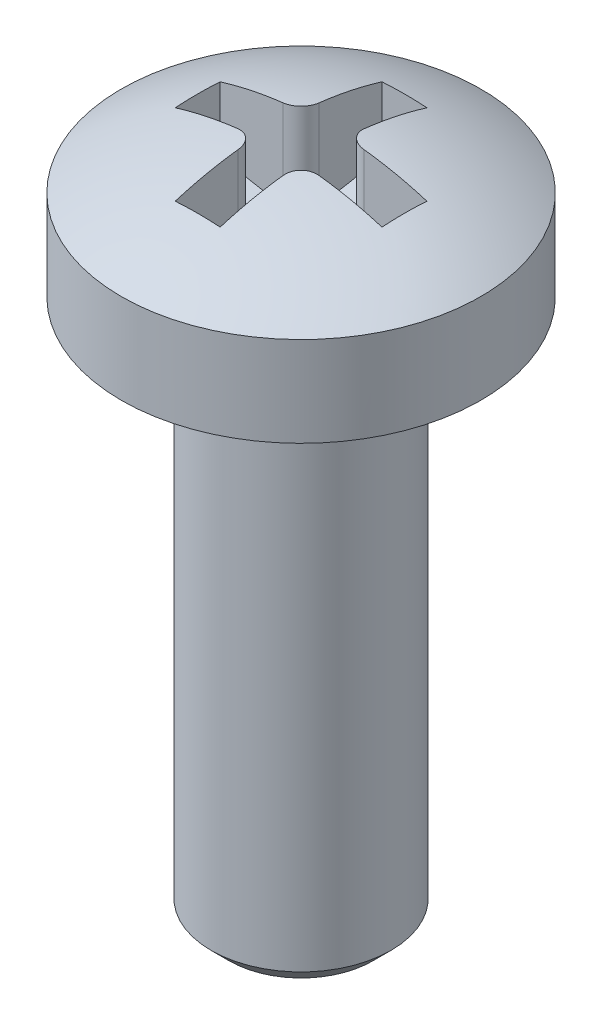
ISO-10303-21;
HEADER;
FILE_DESCRIPTION(('STEP AP214'),'2;1');
FILE_NAME('part.step','',(''),(''),'','','');
FILE_SCHEMA(('AUTOMOTIVE_DESIGN { 1 0 10303 214 1 1 1 1 }'));
ENDSEC;
DATA;
#1=APPLICATION_CONTEXT('core data for automotive mechanical design processes');
#2=APPLICATION_PROTOCOL_DEFINITION('international standard','automotive_design',2000,#1);
#3=PRODUCT_CONTEXT('',#1,'mechanical');
#4=PRODUCT('Part','Part','',(#3));
#5=PRODUCT_RELATED_PRODUCT_CATEGORY('part','',(#4));
#6=PRODUCT_DEFINITION_FORMATION('','',#4);
#7=PRODUCT_DEFINITION_CONTEXT('part definition',#1,'design');
#8=PRODUCT_DEFINITION('design','',#6,#7);
#9=PRODUCT_DEFINITION_SHAPE('','',#8);
#10=(LENGTH_UNIT() NAMED_UNIT(*) SI_UNIT(.MILLI.,.METRE.));
#11=(NAMED_UNIT(*) PLANE_ANGLE_UNIT() SI_UNIT($,.RADIAN.));
#12=(NAMED_UNIT(*) SI_UNIT($,.STERADIAN.) SOLID_ANGLE_UNIT());
#13=UNCERTAINTY_MEASURE_WITH_UNIT(LENGTH_MEASURE(1.E-05),#10,'distance_accuracy_value','');
#14=(GEOMETRIC_REPRESENTATION_CONTEXT(3) GLOBAL_UNCERTAINTY_ASSIGNED_CONTEXT((#13)) GLOBAL_UNIT_ASSIGNED_CONTEXT((#10,
#11,#12)) REPRESENTATION_CONTEXT('',''));
#15=CARTESIAN_POINT('',(0.,0.,0.));
#16=DIRECTION('',(0.,0.,1.));
#17=DIRECTION('',(1.,0.,0.));
#18=AXIS2_PLACEMENT_3D('',#15,#16,#17);
#19=CARTESIAN_POINT('',(2.,-12.,0.));
#20=DIRECTION('',(0.,1.,0.));
#21=DIRECTION('',(0.,0.,1.));
#22=AXIS2_PLACEMENT_3D('',#19,#20,#21);
#23=PLANE('',#22);
#24=CARTESIAN_POINT('',(0.,-12.,0.));
#25=DIRECTION('',(0.,1.,0.));
#26=DIRECTION('',(0.,0.,1.));
#27=AXIS2_PLACEMENT_3D('',#24,#25,#26);
#28=CIRCLE('',#27,1.6);
#29=CARTESIAN_POINT('',(0.,-12.,1.6));
#30=VERTEX_POINT('',#29);
#31=EDGE_CURVE('E11',#30,#30,#28,.F.);
#32=ORIENTED_EDGE('',*,*,#31,.T.);
#33=EDGE_LOOP('',(#32));
#34=FACE_BOUND('',#33,.T.);
#35=ADVANCED_FACE('F37',(#34),#23,.F.);
#36=CARTESIAN_POINT('',(0.,-4.72272727272728,0.));
#37=DIRECTION('',(0.,1.,0.));
#38=DIRECTION('',(1.,0.,0.));
#39=AXIS2_PLACEMENT_3D('',#36,#37,#38);
#40=SPHERICAL_SURFACE('',#39,7.82272727272728);
#41=CARTESIAN_POINT('',(0.5,-4.72272727272728,0.));
#42=DIRECTION('',(1.,0.,0.));
#43=DIRECTION('',(0.,0.,-1.));
#44=AXIS2_PLACEMENT_3D('',#41,#42,#43);
#45=CIRCLE('',#44,7.80673183755348);
#46=CARTESIAN_POINT('',(0.5,2.73750476008987,-2.3));
#47=VERTEX_POINT('',#46);
#48=CARTESIAN_POINT('',(0.5,3.03195273249996,-0.9));
#49=VERTEX_POINT('',#48);
#50=EDGE_CURVE('E195',#47,#49,#45,.T.);
#51=ORIENTED_EDGE('',*,*,#50,.T.);
#52=CARTESIAN_POINT('',(0.5,3.03195273249996,-0.9));
#53=CARTESIAN_POINT('',(0.499980445653111,3.03454133641409,-0.877715199489853));
#54=CARTESIAN_POINT('',(0.501861325410847,3.0369109081898,-0.855406290685576));
#55=CARTESIAN_POINT('',(0.509308944557218,3.04115309750786,-0.811373363194762));
#56=CARTESIAN_POINT('',(0.514874142284133,3.04302592244948,-0.789649103823202));
#57=CARTESIAN_POINT('',(0.529581237998282,3.04621922226135,-0.747382590966706));
#58=CARTESIAN_POINT('',(0.538725894104163,3.0475392695665,-0.726841263013532));
#59=CARTESIAN_POINT('',(0.560335395409864,3.04958563422558,-0.687561895208892));
#60=CARTESIAN_POINT('',(0.572799188800053,3.05031213937239,-0.668823286645484));
#61=CARTESIAN_POINT('',(0.600596407799792,3.05114682561896,-0.633816736919395));
#62=CARTESIAN_POINT('',(0.615908512897499,3.05125942358876,-0.617531968951503));
#63=CARTESIAN_POINT('',(0.649026593510928,3.0508747494218,-0.587736528915892));
#64=CARTESIAN_POINT('',(0.666832948845617,3.05037738431157,-0.57422628012003));
#65=CARTESIAN_POINT('',(0.704363578386314,3.04879030089852,-0.550401537052683));
#66=CARTESIAN_POINT('',(0.724081674108829,3.04770244181268,-0.540077170971166));
#67=CARTESIAN_POINT('',(0.764919862434989,3.04496752601447,-0.522847557382613));
#68=CARTESIAN_POINT('',(0.786039420133905,3.04332068167708,-0.515941013789886));
#69=CARTESIAN_POINT('',(0.822714805755103,3.04007942212771,-0.5072274099574));
#70=CARTESIAN_POINT('',(0.838074093965798,3.03861284502167,-0.504517057384848));
#71=CARTESIAN_POINT('',(0.868957976534767,3.0354499847468,-0.500903202638105));
#72=CARTESIAN_POINT('',(0.88448230264661,3.03375403356009,-0.499997118337815));
#73=CARTESIAN_POINT('',(0.9,3.03195273249996,-0.5));
#74=B_SPLINE_CURVE_WITH_KNOTS('',3,(#52,#53,#54,#55,#56,#57,#58,#59,#60,#61,#62,#63,#64,#65,#66,
#67,#68,#69,#70,#71,#72,#73),.UNSPECIFIED.,.F.,.F.,(4,2,2,2,2,2,2,2,2,2,4),(0.,
0.0672224170043276,0.134416723302517,0.201662907801201,0.26888780779591,0.335628401088124,
0.402379168562592,0.468920974876219,0.535437528240593,0.582332561709017,0.629160434341086),.UNSPECIFIED.);
#75=CARTESIAN_POINT('',(0.9,3.03195273249996,-0.5));
#76=VERTEX_POINT('',#75);
#77=EDGE_CURVE('E257',#49,#76,#74,.T.);
#78=ORIENTED_EDGE('',*,*,#77,.T.);
#79=CARTESIAN_POINT('',(0.,-4.72272727272728,-0.5));
#80=DIRECTION('',(0.,0.,-1.));
#81=DIRECTION('',(-1.,0.,0.));
#82=AXIS2_PLACEMENT_3D('',#79,#80,#81);
#83=CIRCLE('',#82,7.80673183755348);
#84=CARTESIAN_POINT('',(2.3,2.73750476008987,-0.5));
#85=VERTEX_POINT('',#84);
#86=EDGE_CURVE('E193',#76,#85,#83,.T.);
#87=ORIENTED_EDGE('',*,*,#86,.T.);
#88=CARTESIAN_POINT('',(2.3,-4.72272727272728,0.));
#89=DIRECTION('',(1.,0.,0.));
#90=DIRECTION('',(0.,0.,-1.));
#91=AXIS2_PLACEMENT_3D('',#88,#89,#90);
#92=CIRCLE('',#91,7.47696876972688);
#93=CARTESIAN_POINT('',(2.3,2.73750476008987,0.5));
#94=VERTEX_POINT('',#93);
#95=EDGE_CURVE('E170',#85,#94,#92,.T.);
#96=ORIENTED_EDGE('',*,*,#95,.T.);
#97=CARTESIAN_POINT('',(0.,-4.72272727272728,0.5));
#98=DIRECTION('',(0.,0.,1.));
#99=DIRECTION('',(1.,0.,0.));
#100=AXIS2_PLACEMENT_3D('',#97,#98,#99);
#101=CIRCLE('',#100,7.80673183755348);
#102=CARTESIAN_POINT('',(0.9,3.03195273249996,0.5));
#103=VERTEX_POINT('',#102);
#104=EDGE_CURVE('E219',#94,#103,#101,.T.);
#105=ORIENTED_EDGE('',*,*,#104,.T.);
#106=CARTESIAN_POINT('',(0.9,3.03195273249996,0.5));
#107=CARTESIAN_POINT('',(0.877715199489853,3.03454133641409,0.499980445653111));
#108=CARTESIAN_POINT('',(0.855406290685576,3.0369109081898,0.501861325410847));
#109=CARTESIAN_POINT('',(0.811373363194762,3.04115309750786,0.509308944557218));
#110=CARTESIAN_POINT('',(0.789649103823202,3.04302592244948,0.514874142284133));
#111=CARTESIAN_POINT('',(0.747382590966706,3.04621922226135,0.529581237998282));
#112=CARTESIAN_POINT('',(0.726841263013532,3.0475392695665,0.538725894104163));
#113=CARTESIAN_POINT('',(0.687561895208891,3.04958563422558,0.560335395409864));
#114=CARTESIAN_POINT('',(0.668823286645484,3.05031213937239,0.572799188800053));
#115=CARTESIAN_POINT('',(0.633816736919395,3.05114682561896,0.600596407799792));
#116=CARTESIAN_POINT('',(0.617531968951503,3.05125942358877,0.6159085128975));
#117=CARTESIAN_POINT('',(0.587736528915892,3.0508747494218,0.649026593510929));
#118=CARTESIAN_POINT('',(0.57422628012003,3.05037738431157,0.666832948845617));
#119=CARTESIAN_POINT('',(0.550401537052683,3.04879030089852,0.704363578386314));
#120=CARTESIAN_POINT('',(0.540077170971166,3.04770244181268,0.724081674108829));
#121=CARTESIAN_POINT('',(0.522847557382613,3.04496752601447,0.764919862434989));
#122=CARTESIAN_POINT('',(0.515941013789886,3.04332068167708,0.786039420133905));
#123=CARTESIAN_POINT('',(0.5072274099574,3.04007942212771,0.822714805755103));
#124=CARTESIAN_POINT('',(0.504517057384848,3.03861284502167,0.838074093965798));
#125=CARTESIAN_POINT('',(0.500903202638105,3.03544998474679,0.868957976534767));
#126=CARTESIAN_POINT('',(0.499997118337815,3.03375403356009,0.884482302646609));
#127=CARTESIAN_POINT('',(0.5,3.03195273249996,0.9));
#128=B_SPLINE_CURVE_WITH_KNOTS('',3,(#106,#107,#108,#109,#110,#111,#112,#113,#114,#115,#116,
#117,#118,#119,#120,#121,#122,#123,#124,#125,#126,#127),.UNSPECIFIED.,.F.,.F.,(4,2,2,2,2,2,2,2,
2,2,4),(0.,0.0672224170043276,0.134416723302517,0.201662907801201,0.268887807795911,
0.335628401088124,0.402379168562592,0.468920974876219,0.535437528240593,0.582332561709017,
0.629160434341086),.UNSPECIFIED.);
#129=CARTESIAN_POINT('',(0.5,3.03195273249996,0.9));
#130=VERTEX_POINT('',#129);
#131=EDGE_CURVE('E252',#103,#130,#128,.T.);
#132=ORIENTED_EDGE('',*,*,#131,.T.);
#133=CARTESIAN_POINT('',(0.5,-4.72272727272728,0.));
#134=DIRECTION('',(1.,0.,0.));
#135=DIRECTION('',(0.,0.,-1.));
#136=AXIS2_PLACEMENT_3D('',#133,#134,#135);
#137=CIRCLE('',#136,7.80673183755348);
#138=CARTESIAN_POINT('',(0.5,2.73750476008987,2.3));
#139=VERTEX_POINT('',#138);
#140=EDGE_CURVE('E217',#130,#139,#137,.T.);
#141=ORIENTED_EDGE('',*,*,#140,.T.);
#142=CARTESIAN_POINT('',(0.,-4.72272727272728,2.3));
#143=DIRECTION('',(0.,0.,1.));
#144=DIRECTION('',(1.,0.,0.));
#145=AXIS2_PLACEMENT_3D('',#142,#143,#144);
#146=CIRCLE('',#145,7.47696876972688);
#147=CARTESIAN_POINT('',(-0.5,2.73750476008987,2.3));
#148=VERTEX_POINT('',#147);
#149=EDGE_CURVE('E214',#139,#148,#146,.T.);
#150=ORIENTED_EDGE('',*,*,#149,.T.);
#151=CARTESIAN_POINT('',(-0.5,-4.72272727272728,0.));
#152=DIRECTION('',(-1.,0.,0.));
#153=DIRECTION('',(0.,0.,1.));
#154=AXIS2_PLACEMENT_3D('',#151,#152,#153);
#155=CIRCLE('',#154,7.80673183755348);
#156=CARTESIAN_POINT('',(-0.5,3.03195273249996,0.9));
#157=VERTEX_POINT('',#156);
#158=EDGE_CURVE('E211',#148,#157,#155,.T.);
#159=ORIENTED_EDGE('',*,*,#158,.T.);
#160=CARTESIAN_POINT('',(-0.5,3.03195273249996,0.9));
#161=CARTESIAN_POINT('',(-0.499980445653111,3.03454133641409,0.877715199489853));
#162=CARTESIAN_POINT('',(-0.501861325410847,3.0369109081898,0.855406290685576));
#163=CARTESIAN_POINT('',(-0.509308944557218,3.04115309750786,0.811373363194762));
#164=CARTESIAN_POINT('',(-0.514874142284133,3.04302592244948,0.789649103823202));
#165=CARTESIAN_POINT('',(-0.529581237998282,3.04621922226135,0.747382590966706));
#166=CARTESIAN_POINT('',(-0.538725894104163,3.0475392695665,0.726841263013532));
#167=CARTESIAN_POINT('',(-0.560335395409864,3.04958563422558,0.687561895208892));
#168=CARTESIAN_POINT('',(-0.572799188800053,3.05031213937239,0.668823286645484));
#169=CARTESIAN_POINT('',(-0.600596407799792,3.05114682561896,0.633816736919395));
#170=CARTESIAN_POINT('',(-0.6159085128975,3.05125942358876,0.617531968951503));
#171=CARTESIAN_POINT('',(-0.649026593510929,3.0508747494218,0.587736528915892));
#172=CARTESIAN_POINT('',(-0.666832948845617,3.05037738431157,0.57422628012003));
#173=CARTESIAN_POINT('',(-0.704363578386314,3.04879030089852,0.550401537052683));
#174=CARTESIAN_POINT('',(-0.724081674108829,3.04770244181268,0.540077170971166));
#175=CARTESIAN_POINT('',(-0.764919862434989,3.04496752601447,0.522847557382613));
#176=CARTESIAN_POINT('',(-0.786039420133905,3.04332068167708,0.515941013789887));
#177=CARTESIAN_POINT('',(-0.822714805755103,3.04007942212771,0.5072274099574));
#178=CARTESIAN_POINT('',(-0.838074093965798,3.03861284502167,0.504517057384848));
#179=CARTESIAN_POINT('',(-0.868957976534767,3.0354499847468,0.500903202638105));
#180=CARTESIAN_POINT('',(-0.88448230264661,3.03375403356009,0.499997118337815));
#181=CARTESIAN_POINT('',(-0.9,3.03195273249996,0.5));
#182=B_SPLINE_CURVE_WITH_KNOTS('',3,(#160,#161,#162,#163,#164,#165,#166,#167,#168,#169,#170,
#171,#172,#173,#174,#175,#176,#177,#178,#179,#180,#181),.UNSPECIFIED.,.F.,.F.,(4,2,2,2,2,2,2,2,
2,2,4),(0.,0.0672224170043276,0.134416723302517,0.201662907801201,0.26888780779591,
0.335628401088124,0.402379168562592,0.468920974876219,0.535437528240592,0.582332561709017,
0.629160434341086),.UNSPECIFIED.);
#183=CARTESIAN_POINT('',(-0.9,3.03195273249996,0.5));
#184=VERTEX_POINT('',#183);
#185=EDGE_CURVE('E231',#157,#184,#182,.T.);
#186=ORIENTED_EDGE('',*,*,#185,.T.);
#187=CARTESIAN_POINT('',(0.,-4.72272727272728,0.5));
#188=DIRECTION('',(0.,0.,1.));
#189=DIRECTION('',(1.,0.,0.));
#190=AXIS2_PLACEMENT_3D('',#187,#188,#189);
#191=CIRCLE('',#190,7.80673183755348);
#192=CARTESIAN_POINT('',(-2.3,2.73750476008987,0.5));
#193=VERTEX_POINT('',#192);
#194=EDGE_CURVE('E209',#184,#193,#191,.T.);
#195=ORIENTED_EDGE('',*,*,#194,.T.);
#196=CARTESIAN_POINT('',(-2.3,-4.72272727272728,0.));
#197=DIRECTION('',(-1.,0.,0.));
#198=DIRECTION('',(0.,0.,1.));
#199=AXIS2_PLACEMENT_3D('',#196,#197,#198);
#200=CIRCLE('',#199,7.47696876972688);
#201=CARTESIAN_POINT('',(-2.3,2.73750476008987,-0.5));
#202=VERTEX_POINT('',#201);
#203=EDGE_CURVE('E206',#193,#202,#200,.T.);
#204=ORIENTED_EDGE('',*,*,#203,.T.);
#205=CARTESIAN_POINT('',(0.,-4.72272727272728,-0.5));
#206=DIRECTION('',(0.,0.,-1.));
#207=DIRECTION('',(-1.,0.,0.));
#208=AXIS2_PLACEMENT_3D('',#205,#206,#207);
#209=CIRCLE('',#208,7.80673183755348);
#210=CARTESIAN_POINT('',(-0.9,3.03195273249996,-0.5));
#211=VERTEX_POINT('',#210);
#212=EDGE_CURVE('E203',#202,#211,#209,.T.);
#213=ORIENTED_EDGE('',*,*,#212,.T.);
#214=CARTESIAN_POINT('',(-0.9,3.03195273249996,-0.5));
#215=CARTESIAN_POINT('',(-0.877715199489853,3.03454133641409,-0.499980445653111));
#216=CARTESIAN_POINT('',(-0.855406290685576,3.0369109081898,-0.501861325410847));
#217=CARTESIAN_POINT('',(-0.811373363194762,3.04115309750786,-0.509308944557218));
#218=CARTESIAN_POINT('',(-0.789649103823202,3.04302592244948,-0.514874142284133));
#219=CARTESIAN_POINT('',(-0.747382590966706,3.04621922226135,-0.529581237998282));
#220=CARTESIAN_POINT('',(-0.726841263013532,3.0475392695665,-0.538725894104163));
#221=CARTESIAN_POINT('',(-0.687561895208892,3.04958563422558,-0.560335395409864));
#222=CARTESIAN_POINT('',(-0.668823286645484,3.05031213937239,-0.572799188800053));
#223=CARTESIAN_POINT('',(-0.633816736919395,3.05114682561896,-0.600596407799792));
#224=CARTESIAN_POINT('',(-0.617531968951503,3.05125942358877,-0.6159085128975));
#225=CARTESIAN_POINT('',(-0.587736528915892,3.0508747494218,-0.649026593510929));
#226=CARTESIAN_POINT('',(-0.57422628012003,3.05037738431157,-0.666832948845617));
#227=CARTESIAN_POINT('',(-0.550401537052683,3.04879030089852,-0.704363578386314));
#228=CARTESIAN_POINT('',(-0.540077170971166,3.04770244181268,-0.724081674108829));
#229=CARTESIAN_POINT('',(-0.522847557382613,3.04496752601447,-0.764919862434989));
#230=CARTESIAN_POINT('',(-0.515941013789887,3.04332068167708,-0.786039420133905));
#231=CARTESIAN_POINT('',(-0.5072274099574,3.04007942212771,-0.822714805755103));
#232=CARTESIAN_POINT('',(-0.504517057384848,3.03861284502167,-0.838074093965798));
#233=CARTESIAN_POINT('',(-0.500903202638105,3.03544998474679,-0.868957976534767));
#234=CARTESIAN_POINT('',(-0.499997118337815,3.03375403356009,-0.88448230264661));
#235=CARTESIAN_POINT('',(-0.5,3.03195273249996,-0.9));
#236=B_SPLINE_CURVE_WITH_KNOTS('',3,(#214,#215,#216,#217,#218,#219,#220,#221,#222,#223,#224,
#225,#226,#227,#228,#229,#230,#231,#232,#233,#234,#235),.UNSPECIFIED.,.F.,.F.,(4,2,2,2,2,2,2,2,
2,2,4),(0.,0.0672224170043276,0.134416723302517,0.201662907801201,0.268887807795911,
0.335628401088124,0.402379168562592,0.468920974876219,0.535437528240593,0.582332561709018,
0.629160434341086),.UNSPECIFIED.);
#237=CARTESIAN_POINT('',(-0.5,3.03195273249996,-0.9));
#238=VERTEX_POINT('',#237);
#239=EDGE_CURVE('E225',#211,#238,#236,.T.);
#240=ORIENTED_EDGE('',*,*,#239,.T.);
#241=CARTESIAN_POINT('',(-0.5,-4.72272727272728,0.));
#242=DIRECTION('',(-1.,0.,0.));
#243=DIRECTION('',(0.,0.,1.));
#244=AXIS2_PLACEMENT_3D('',#241,#242,#243);
#245=CIRCLE('',#244,7.80673183755348);
#246=CARTESIAN_POINT('',(-0.5,2.73750476008987,-2.3));
#247=VERTEX_POINT('',#246);
#248=EDGE_CURVE('E201',#238,#247,#245,.T.);
#249=ORIENTED_EDGE('',*,*,#248,.T.);
#250=CARTESIAN_POINT('',(0.,-4.72272727272728,-2.3));
#251=DIRECTION('',(0.,0.,-1.));
#252=DIRECTION('',(-1.,0.,0.));
#253=AXIS2_PLACEMENT_3D('',#250,#251,#252);
#254=CIRCLE('',#253,7.47696876972688);
#255=EDGE_CURVE('E198',#247,#47,#254,.T.);
#256=ORIENTED_EDGE('',*,*,#255,.T.);
#257=EDGE_LOOP('',(#51,#78,#87,#96,#105,#132,#141,#150,#159,#186,#195,#204,#213,#240,#249,#256));
#258=FACE_BOUND('',#257,.T.);
#259=CARTESIAN_POINT('',(0.,2.,0.));
#260=DIRECTION('',(0.,1.,0.));
#261=DIRECTION('',(0.,0.,1.));
#262=AXIS2_PLACEMENT_3D('',#259,#260,#261);
#263=CIRCLE('',#262,4.);
#264=CARTESIAN_POINT('',(0.,2.,4.));
#265=VERTEX_POINT('',#264);
#266=EDGE_CURVE('E189',#265,#265,#263,.T.);
#267=ORIENTED_EDGE('',*,*,#266,.T.);
#268=EDGE_LOOP('',(#267));
#269=FACE_BOUND('',#268,.T.);
#270=ADVANCED_FACE('F239',(#258,#269),#40,.T.);
#271=CARTESIAN_POINT('',(0.,3.1,0.));
#272=DIRECTION('',(0.,1.,0.));
#273=DIRECTION('',(0.,0.,1.));
#274=AXIS2_PLACEMENT_3D('',#271,#272,#273);
#275=CYLINDRICAL_SURFACE('',#274,4.);
#276=ORIENTED_EDGE('',*,*,#266,.F.);
#277=EDGE_LOOP('',(#276));
#278=FACE_BOUND('',#277,.T.);
#279=CARTESIAN_POINT('',(0.,0.,0.));
#280=DIRECTION('',(0.,1.,0.));
#281=DIRECTION('',(0.,0.,1.));
#282=AXIS2_PLACEMENT_3D('',#279,#280,#281);
#283=CIRCLE('',#282,4.);
#284=CARTESIAN_POINT('',(0.,0.,4.));
#285=VERTEX_POINT('',#284);
#286=EDGE_CURVE('E181',#285,#285,#283,.T.);
#287=ORIENTED_EDGE('',*,*,#286,.T.);
#288=EDGE_LOOP('',(#287));
#289=FACE_BOUND('',#288,.T.);
#290=ADVANCED_FACE('F244',(#278,#289),#275,.T.);
#291=CARTESIAN_POINT('',(4.,0.,0.));
#292=DIRECTION('',(0.,1.,0.));
#293=DIRECTION('',(0.,0.,1.));
#294=AXIS2_PLACEMENT_3D('',#291,#292,#293);
#295=PLANE('',#294);
#296=ORIENTED_EDGE('',*,*,#286,.F.);
#297=EDGE_LOOP('',(#296));
#298=FACE_BOUND('',#297,.T.);
#299=CARTESIAN_POINT('',(0.,0.,0.));
#300=DIRECTION('',(0.,1.,0.));
#301=DIRECTION('',(0.,0.,1.));
#302=AXIS2_PLACEMENT_3D('',#299,#300,#301);
#303=CIRCLE('',#302,2.);
#304=CARTESIAN_POINT('',(0.,0.,2.));
#305=VERTEX_POINT('',#304);
#306=EDGE_CURVE('E178',#305,#305,#303,.T.);
#307=ORIENTED_EDGE('',*,*,#306,.T.);
#308=EDGE_LOOP('',(#307));
#309=FACE_BOUND('',#308,.T.);
#310=ADVANCED_FACE('F331',(#298,#309),#295,.F.);
#311=CARTESIAN_POINT('',(0.,3.1,0.));
#312=DIRECTION('',(0.,1.,0.));
#313=DIRECTION('',(0.,0.,1.));
#314=AXIS2_PLACEMENT_3D('',#311,#312,#313);
#315=CYLINDRICAL_SURFACE('',#314,2.);
#316=CARTESIAN_POINT('',(0.,-11.6,0.));
#317=DIRECTION('',(0.,1.,0.));
#318=DIRECTION('',(0.,0.,1.));
#319=AXIS2_PLACEMENT_3D('',#316,#317,#318);
#320=CIRCLE('',#319,2.);
#321=CARTESIAN_POINT('',(0.,-11.6,2.));
#322=VERTEX_POINT('',#321);
#323=EDGE_CURVE('E45',#322,#322,#320,.T.);
#324=ORIENTED_EDGE('',*,*,#323,.T.);
#325=EDGE_LOOP('',(#324));
#326=FACE_BOUND('',#325,.T.);
#327=ORIENTED_EDGE('',*,*,#306,.F.);
#328=EDGE_LOOP('',(#327));
#329=FACE_BOUND('',#328,.T.);
#330=ADVANCED_FACE('F303',(#326,#329),#315,.T.);
#331=CARTESIAN_POINT('',(0.5,-12.001,0.5));
#332=DIRECTION('',(0.,0.,1.));
#333=DIRECTION('',(1.,0.,0.));
#334=AXIS2_PLACEMENT_3D('',#331,#332,#333);
#335=PLANE('',#334);
#336=CARTESIAN_POINT('',(0.,9.49999999999998,0.5));
#337=DIRECTION('',(0.,0.,1.));
#338=DIRECTION('',(1.,0.,0.));
#339=AXIS2_PLACEMENT_3D('',#336,#337,#338);
#340=CIRCLE('',#339,8.48528137423855);
#341=CARTESIAN_POINT('',(2.3,1.3323810079069,0.5));
#342=VERTEX_POINT('',#341);
#343=CARTESIAN_POINT('',(0.9,1.06258333374486,0.5));
#344=VERTEX_POINT('',#343);
#345=EDGE_CURVE('E176',#342,#344,#340,.F.);
#346=ORIENTED_EDGE('',*,*,#345,.T.);
#347=DIRECTION('',(0.,1.,0.));
#348=VECTOR('',#347,1.);
#349=CARTESIAN_POINT('',(0.9,-12.001,0.5));
#350=LINE('',#349,#348);
#351=EDGE_CURVE('E556',#344,#103,#350,.T.);
#352=ORIENTED_EDGE('',*,*,#351,.T.);
#353=ORIENTED_EDGE('',*,*,#104,.F.);
#354=DIRECTION('',(0.,1.,0.));
#355=VECTOR('',#354,1.);
#356=CARTESIAN_POINT('',(2.3,-12.001,0.5));
#357=LINE('',#356,#355);
#358=EDGE_CURVE('E172',#342,#94,#357,.T.);
#359=ORIENTED_EDGE('',*,*,#358,.F.);
#360=EDGE_LOOP('',(#346,#352,#353,#359));
#361=FACE_BOUND('',#360,.T.);
#362=ADVANCED_FACE('F344',(#361),#335,.F.);
#363=CARTESIAN_POINT('',(0.5,-12.001,0.5));
#364=DIRECTION('',(1.,0.,0.));
#365=DIRECTION('',(0.,0.,-1.));
#366=AXIS2_PLACEMENT_3D('',#363,#364,#365);
#367=PLANE('',#366);
#368=ORIENTED_EDGE('',*,*,#140,.F.);
#369=DIRECTION('',(0.,1.,0.));
#370=VECTOR('',#369,1.);
#371=CARTESIAN_POINT('',(0.5,-12.001,0.9));
#372=LINE('',#371,#370);
#373=CARTESIAN_POINT('',(0.5,1.06258333374486,0.9));
#374=VERTEX_POINT('',#373);
#375=EDGE_CURVE('E554',#130,#374,#372,.F.);
#376=ORIENTED_EDGE('',*,*,#375,.T.);
#377=CARTESIAN_POINT('',(0.5,9.49999999999998,0.));
#378=DIRECTION('',(1.,0.,0.));
#379=DIRECTION('',(0.,0.,-1.));
#380=AXIS2_PLACEMENT_3D('',#377,#378,#379);
#381=CIRCLE('',#380,8.48528137423855);
#382=CARTESIAN_POINT('',(0.5,1.3323810079069,2.3));
#383=VERTEX_POINT('',#382);
#384=EDGE_CURVE('E183',#374,#383,#381,.F.);
#385=ORIENTED_EDGE('',*,*,#384,.T.);
#386=DIRECTION('',(0.,1.,0.));
#387=VECTOR('',#386,1.);
#388=CARTESIAN_POINT('',(0.5,-12.001,2.3));
#389=LINE('',#388,#387);
#390=EDGE_CURVE('E162',#383,#139,#389,.T.);
#391=ORIENTED_EDGE('',*,*,#390,.T.);
#392=EDGE_LOOP('',(#368,#376,#385,#391));
#393=FACE_BOUND('',#392,.T.);
#394=ADVANCED_FACE('F292',(#393),#367,.F.);
#395=CARTESIAN_POINT('',(-0.5,-12.001,2.3));
#396=DIRECTION('',(0.,0.,1.));
#397=DIRECTION('',(1.,0.,0.));
#398=AXIS2_PLACEMENT_3D('',#395,#396,#397);
#399=PLANE('',#398);
#400=ORIENTED_EDGE('',*,*,#390,.F.);
#401=CARTESIAN_POINT('',(0.,9.49999999999998,2.3));
#402=DIRECTION('',(0.,0.,1.));
#403=DIRECTION('',(1.,0.,0.));
#404=AXIS2_PLACEMENT_3D('',#401,#402,#403);
#405=CIRCLE('',#404,8.18290901819149);
#406=CARTESIAN_POINT('',(-0.5,1.3323810079069,2.3));
#407=VERTEX_POINT('',#406);
#408=EDGE_CURVE('E518',#383,#407,#405,.F.);
#409=ORIENTED_EDGE('',*,*,#408,.T.);
#410=DIRECTION('',(0.,1.,0.));
#411=VECTOR('',#410,1.);
#412=CARTESIAN_POINT('',(-0.5,-12.001,2.3));
#413=LINE('',#412,#411);
#414=EDGE_CURVE('E517',#407,#148,#413,.T.);
#415=ORIENTED_EDGE('',*,*,#414,.T.);
#416=ORIENTED_EDGE('',*,*,#149,.F.);
#417=EDGE_LOOP('',(#400,#409,#415,#416));
#418=FACE_BOUND('',#417,.T.);
#419=ADVANCED_FACE('F357',(#418),#399,.F.);
#420=CARTESIAN_POINT('',(-0.5,-12.001,0.5));
#421=DIRECTION('',(-1.,0.,0.));
#422=DIRECTION('',(0.,0.,1.));
#423=AXIS2_PLACEMENT_3D('',#420,#421,#422);
#424=PLANE('',#423);
#425=CARTESIAN_POINT('',(-0.5,9.49999999999998,0.));
#426=DIRECTION('',(-1.,0.,0.));
#427=DIRECTION('',(0.,0.,1.));
#428=AXIS2_PLACEMENT_3D('',#425,#426,#427);
#429=CIRCLE('',#428,8.48528137423855);
#430=CARTESIAN_POINT('',(-0.5,1.06258333374486,0.9));
#431=VERTEX_POINT('',#430);
#432=EDGE_CURVE('E512',#407,#431,#429,.F.);
#433=ORIENTED_EDGE('',*,*,#432,.T.);
#434=DIRECTION('',(0.,1.,0.));
#435=VECTOR('',#434,1.);
#436=CARTESIAN_POINT('',(-0.5,-12.001,0.9));
#437=LINE('',#436,#435);
#438=EDGE_CURVE('E507',#431,#157,#437,.T.);
#439=ORIENTED_EDGE('',*,*,#438,.T.);
#440=ORIENTED_EDGE('',*,*,#158,.F.);
#441=ORIENTED_EDGE('',*,*,#414,.F.);
#442=EDGE_LOOP('',(#433,#439,#440,#441));
#443=FACE_BOUND('',#442,.T.);
#444=ADVANCED_FACE('F364',(#443),#424,.F.);
#445=CARTESIAN_POINT('',(-2.3,-12.001,0.5));
#446=DIRECTION('',(0.,0.,1.));
#447=DIRECTION('',(1.,0.,0.));
#448=AXIS2_PLACEMENT_3D('',#445,#446,#447);
#449=PLANE('',#448);
#450=ORIENTED_EDGE('',*,*,#194,.F.);
#451=DIRECTION('',(0.,1.,0.));
#452=VECTOR('',#451,1.);
#453=CARTESIAN_POINT('',(-0.9,-12.001,0.5));
#454=LINE('',#453,#452);
#455=CARTESIAN_POINT('',(-0.9,1.06258333374486,0.5));
#456=VERTEX_POINT('',#455);
#457=EDGE_CURVE('E505',#184,#456,#454,.F.);
#458=ORIENTED_EDGE('',*,*,#457,.T.);
#459=CARTESIAN_POINT('',(0.,9.49999999999998,0.5));
#460=DIRECTION('',(0.,0.,1.));
#461=DIRECTION('',(1.,0.,0.));
#462=AXIS2_PLACEMENT_3D('',#459,#460,#461);
#463=CIRCLE('',#462,8.48528137423855);
#464=CARTESIAN_POINT('',(-2.3,1.3323810079069,0.5));
#465=VERTEX_POINT('',#464);
#466=EDGE_CURVE('E515',#456,#465,#463,.F.);
#467=ORIENTED_EDGE('',*,*,#466,.T.);
#468=DIRECTION('',(0.,1.,0.));
#469=VECTOR('',#468,1.);
#470=CARTESIAN_POINT('',(-2.3,-12.001,0.5));
#471=LINE('',#470,#469);
#472=EDGE_CURVE('E529',#465,#193,#471,.T.);
#473=ORIENTED_EDGE('',*,*,#472,.T.);
#474=EDGE_LOOP('',(#450,#458,#467,#473));
#475=FACE_BOUND('',#474,.T.);
#476=ADVANCED_FACE('F371',(#475),#449,.F.);
#477=CARTESIAN_POINT('',(-2.3,-12.001,-0.5));
#478=DIRECTION('',(-1.,0.,0.));
#479=DIRECTION('',(0.,0.,1.));
#480=AXIS2_PLACEMENT_3D('',#477,#478,#479);
#481=PLANE('',#480);
#482=ORIENTED_EDGE('',*,*,#472,.F.);
#483=CARTESIAN_POINT('',(-2.3,9.49999999999998,0.));
#484=DIRECTION('',(-1.,0.,0.));
#485=DIRECTION('',(0.,0.,1.));
#486=AXIS2_PLACEMENT_3D('',#483,#484,#485);
#487=CIRCLE('',#486,8.18290901819149);
#488=CARTESIAN_POINT('',(-2.3,1.3323810079069,-0.5));
#489=VERTEX_POINT('',#488);
#490=EDGE_CURVE('E521',#465,#489,#487,.F.);
#491=ORIENTED_EDGE('',*,*,#490,.T.);
#492=DIRECTION('',(0.,1.,0.));
#493=VECTOR('',#492,1.);
#494=CARTESIAN_POINT('',(-2.3,-12.001,-0.5));
#495=LINE('',#494,#493);
#496=EDGE_CURVE('E532',#489,#202,#495,.T.);
#497=ORIENTED_EDGE('',*,*,#496,.T.);
#498=ORIENTED_EDGE('',*,*,#203,.F.);
#499=EDGE_LOOP('',(#482,#491,#497,#498));
#500=FACE_BOUND('',#499,.T.);
#501=ADVANCED_FACE('F379',(#500),#481,.F.);
#502=CARTESIAN_POINT('',(-2.3,-12.001,-0.5));
#503=DIRECTION('',(0.,0.,-1.));
#504=DIRECTION('',(-1.,0.,0.));
#505=AXIS2_PLACEMENT_3D('',#502,#503,#504);
#506=PLANE('',#505);
#507=CARTESIAN_POINT('',(0.,9.49999999999998,-0.5));
#508=DIRECTION('',(0.,0.,-1.));
#509=DIRECTION('',(-1.,0.,0.));
#510=AXIS2_PLACEMENT_3D('',#507,#508,#509);
#511=CIRCLE('',#510,8.48528137423855);
#512=CARTESIAN_POINT('',(-0.9,1.06258333374486,-0.5));
#513=VERTEX_POINT('',#512);
#514=EDGE_CURVE('E564',#489,#513,#511,.F.);
#515=ORIENTED_EDGE('',*,*,#514,.T.);
#516=DIRECTION('',(0.,1.,0.));
#517=VECTOR('',#516,1.);
#518=CARTESIAN_POINT('',(-0.9,-12.001,-0.5));
#519=LINE('',#518,#517);
#520=EDGE_CURVE('E549',#513,#211,#519,.T.);
#521=ORIENTED_EDGE('',*,*,#520,.T.);
#522=ORIENTED_EDGE('',*,*,#212,.F.);
#523=ORIENTED_EDGE('',*,*,#496,.F.);
#524=EDGE_LOOP('',(#515,#521,#522,#523));
#525=FACE_BOUND('',#524,.T.);
#526=ADVANCED_FACE('F387',(#525),#506,.F.);
#527=CARTESIAN_POINT('',(-0.5,-12.001,-2.3));
#528=DIRECTION('',(-1.,0.,0.));
#529=DIRECTION('',(0.,0.,1.));
#530=AXIS2_PLACEMENT_3D('',#527,#528,#529);
#531=PLANE('',#530);
#532=ORIENTED_EDGE('',*,*,#248,.F.);
#533=DIRECTION('',(0.,1.,0.));
#534=VECTOR('',#533,1.);
#535=CARTESIAN_POINT('',(-0.5,-12.001,-0.9));
#536=LINE('',#535,#534);
#537=CARTESIAN_POINT('',(-0.5,1.06258333374486,-0.9));
#538=VERTEX_POINT('',#537);
#539=EDGE_CURVE('E52',#238,#538,#536,.F.);
#540=ORIENTED_EDGE('',*,*,#539,.T.);
#541=CARTESIAN_POINT('',(-0.5,9.49999999999998,0.));
#542=DIRECTION('',(-1.,0.,0.));
#543=DIRECTION('',(0.,0.,1.));
#544=AXIS2_PLACEMENT_3D('',#541,#542,#543);
#545=CIRCLE('',#544,8.48528137423855);
#546=CARTESIAN_POINT('',(-0.5,1.3323810079069,-2.3));
#547=VERTEX_POINT('',#546);
#548=EDGE_CURVE('E560',#538,#547,#545,.F.);
#549=ORIENTED_EDGE('',*,*,#548,.T.);
#550=DIRECTION('',(0.,1.,0.));
#551=VECTOR('',#550,1.);
#552=CARTESIAN_POINT('',(-0.5,-12.001,-2.3));
#553=LINE('',#552,#551);
#554=EDGE_CURVE('E535',#547,#247,#553,.T.);
#555=ORIENTED_EDGE('',*,*,#554,.T.);
#556=EDGE_LOOP('',(#532,#540,#549,#555));
#557=FACE_BOUND('',#556,.T.);
#558=ADVANCED_FACE('F395',(#557),#531,.F.);
#559=CARTESIAN_POINT('',(-0.5,-12.001,-2.3));
#560=DIRECTION('',(0.,0.,-1.));
#561=DIRECTION('',(-1.,0.,0.));
#562=AXIS2_PLACEMENT_3D('',#559,#560,#561);
#563=PLANE('',#562);
#564=ORIENTED_EDGE('',*,*,#554,.F.);
#565=CARTESIAN_POINT('',(0.,9.49999999999998,-2.3));
#566=DIRECTION('',(0.,0.,-1.));
#567=DIRECTION('',(-1.,0.,0.));
#568=AXIS2_PLACEMENT_3D('',#565,#566,#567);
#569=CIRCLE('',#568,8.18290901819149);
#570=CARTESIAN_POINT('',(0.5,1.3323810079069,-2.3));
#571=VERTEX_POINT('',#570);
#572=EDGE_CURVE('E543',#547,#571,#569,.F.);
#573=ORIENTED_EDGE('',*,*,#572,.T.);
#574=DIRECTION('',(0.,1.,0.));
#575=VECTOR('',#574,1.);
#576=CARTESIAN_POINT('',(0.5,-12.001,-2.3));
#577=LINE('',#576,#575);
#578=EDGE_CURVE('E171',#571,#47,#577,.T.);
#579=ORIENTED_EDGE('',*,*,#578,.T.);
#580=ORIENTED_EDGE('',*,*,#255,.F.);
#581=EDGE_LOOP('',(#564,#573,#579,#580));
#582=FACE_BOUND('',#581,.T.);
#583=ADVANCED_FACE('F403',(#582),#563,.F.);
#584=CARTESIAN_POINT('',(0.5,-12.001,-2.3));
#585=DIRECTION('',(1.,0.,0.));
#586=DIRECTION('',(0.,0.,-1.));
#587=AXIS2_PLACEMENT_3D('',#584,#585,#586);
#588=PLANE('',#587);
#589=CARTESIAN_POINT('',(0.5,9.49999999999998,0.));
#590=DIRECTION('',(1.,0.,0.));
#591=DIRECTION('',(0.,0.,-1.));
#592=AXIS2_PLACEMENT_3D('',#589,#590,#591);
#593=CIRCLE('',#592,8.48528137423855);
#594=CARTESIAN_POINT('',(0.5,1.06258333374486,-0.9));
#595=VERTEX_POINT('',#594);
#596=EDGE_CURVE('E161',#571,#595,#593,.F.);
#597=ORIENTED_EDGE('',*,*,#596,.T.);
#598=DIRECTION('',(0.,1.,0.));
#599=VECTOR('',#598,1.);
#600=CARTESIAN_POINT('',(0.5,-12.001,-0.9));
#601=LINE('',#600,#599);
#602=EDGE_CURVE('E222',#595,#49,#601,.T.);
#603=ORIENTED_EDGE('',*,*,#602,.T.);
#604=ORIENTED_EDGE('',*,*,#50,.F.);
#605=ORIENTED_EDGE('',*,*,#578,.F.);
#606=EDGE_LOOP('',(#597,#603,#604,#605));
#607=FACE_BOUND('',#606,.T.);
#608=ADVANCED_FACE('F410',(#607),#588,.F.);
#609=CARTESIAN_POINT('',(0.5,-12.001,-0.5));
#610=DIRECTION('',(0.,0.,-1.));
#611=DIRECTION('',(-1.,0.,0.));
#612=AXIS2_PLACEMENT_3D('',#609,#610,#611);
#613=PLANE('',#612);
#614=ORIENTED_EDGE('',*,*,#86,.F.);
#615=DIRECTION('',(0.,1.,0.));
#616=VECTOR('',#615,1.);
#617=CARTESIAN_POINT('',(0.9,-12.001,-0.5));
#618=LINE('',#617,#616);
#619=CARTESIAN_POINT('',(0.9,1.06258333374486,-0.5));
#620=VERTEX_POINT('',#619);
#621=EDGE_CURVE('E158',#76,#620,#618,.F.);
#622=ORIENTED_EDGE('',*,*,#621,.T.);
#623=CARTESIAN_POINT('',(0.,9.49999999999998,-0.5));
#624=DIRECTION('',(0.,0.,-1.));
#625=DIRECTION('',(-1.,0.,0.));
#626=AXIS2_PLACEMENT_3D('',#623,#624,#625);
#627=CIRCLE('',#626,8.48528137423855);
#628=CARTESIAN_POINT('',(2.3,1.3323810079069,-0.5));
#629=VERTEX_POINT('',#628);
#630=EDGE_CURVE('E152',#620,#629,#627,.F.);
#631=ORIENTED_EDGE('',*,*,#630,.T.);
#632=DIRECTION('',(0.,1.,0.));
#633=VECTOR('',#632,1.);
#634=CARTESIAN_POINT('',(2.3,-12.001,-0.5));
#635=LINE('',#634,#633);
#636=EDGE_CURVE('E156',#629,#85,#635,.T.);
#637=ORIENTED_EDGE('',*,*,#636,.T.);
#638=EDGE_LOOP('',(#614,#622,#631,#637));
#639=FACE_BOUND('',#638,.T.);
#640=ADVANCED_FACE('F155',(#639),#613,.F.);
#641=CARTESIAN_POINT('',(2.3,-12.001,-0.5));
#642=DIRECTION('',(1.,0.,0.));
#643=DIRECTION('',(0.,0.,-1.));
#644=AXIS2_PLACEMENT_3D('',#641,#642,#643);
#645=PLANE('',#644);
#646=ORIENTED_EDGE('',*,*,#636,.F.);
#647=CARTESIAN_POINT('',(2.3,9.49999999999998,0.));
#648=DIRECTION('',(1.,0.,0.));
#649=DIRECTION('',(0.,0.,-1.));
#650=AXIS2_PLACEMENT_3D('',#647,#648,#649);
#651=CIRCLE('',#650,8.18290901819149);
#652=EDGE_CURVE('E167',#629,#342,#651,.F.);
#653=ORIENTED_EDGE('',*,*,#652,.T.);
#654=ORIENTED_EDGE('',*,*,#358,.T.);
#655=ORIENTED_EDGE('',*,*,#95,.F.);
#656=EDGE_LOOP('',(#646,#653,#654,#655));
#657=FACE_BOUND('',#656,.T.);
#658=ADVANCED_FACE('F166',(#657),#645,.F.);
#659=CARTESIAN_POINT('',(0.,9.49999999999998,0.));
#660=DIRECTION('',(0.,1.,0.));
#661=DIRECTION('',(1.,0.,0.));
#662=AXIS2_PLACEMENT_3D('',#659,#660,#661);
#663=SPHERICAL_SURFACE('',#662,8.49999999999998);
#664=ORIENTED_EDGE('',*,*,#345,.F.);
#665=ORIENTED_EDGE('',*,*,#652,.F.);
#666=ORIENTED_EDGE('',*,*,#630,.F.);
#667=CARTESIAN_POINT('',(0.9,1.06258333374486,-0.5));
#668=CARTESIAN_POINT('',(0.877681895176581,1.06020064583187,-0.499980506377996));
#669=CARTESIAN_POINT('',(0.855344205727362,1.0580201488652,-0.501866869905914));
#670=CARTESIAN_POINT('',(0.811264196369215,1.05411756501269,-0.509332340473144));
#671=CARTESIAN_POINT('',(0.78952159882242,1.05239526097159,-0.514909693823375));
#672=CARTESIAN_POINT('',(0.747228556255667,1.04945966047884,-0.529643735623788));
#673=CARTESIAN_POINT('',(0.726678990033897,1.04824673524169,-0.538803025087882));
#674=CARTESIAN_POINT('',(0.687389852539137,1.04636746374655,-0.560442280349619));
#675=CARTESIAN_POINT('',(0.668649749482246,1.04570095646757,-0.572921266446781));
#676=CARTESIAN_POINT('',(0.633625729643449,1.04493649451643,-0.600763861630353));
#677=CARTESIAN_POINT('',(0.617327507926939,1.04483509156346,-0.616109383561911));
#678=CARTESIAN_POINT('',(0.587514637710959,1.04519463942213,-0.649299998886555));
#679=CARTESIAN_POINT('',(0.574000432084661,1.04565567962496,-0.667145489209941));
#680=CARTESIAN_POINT('',(0.55017165377276,1.04712438551599,-0.704769667803527));
#681=CARTESIAN_POINT('',(0.539848822620757,1.04813062146146,-0.724543189195622));
#682=CARTESIAN_POINT('',(0.522637980126425,1.05065941614313,-0.765498290560969));
#683=CARTESIAN_POINT('',(0.515748559609182,1.05218176262027,-0.78667928881133));
#684=CARTESIAN_POINT('',(0.507116958212197,1.05516459963325,-0.823303350164225));
#685=CARTESIAN_POINT('',(0.504448298653858,1.05650461680506,-0.838544928463922));
#686=CARTESIAN_POINT('',(0.500889732891837,1.05939256924764,-0.869192646434852));
#687=CARTESIAN_POINT('',(0.499997287547255,1.06094020433808,-0.884598519500552));
#688=CARTESIAN_POINT('',(0.5,1.06258333374486,-0.9));
#689=B_SPLINE_CURVE_WITH_KNOTS('',3,(#667,#668,#669,#670,#671,#672,#673,#674,#675,#676,#677,
#678,#679,#680,#681,#682,#683,#684,#685,#686,#687,#688),.UNSPECIFIED.,.F.,.F.,(4,2,2,2,2,2,2,2,
2,2,4),(0.,0.0672520458092346,0.134472161271656,0.201741179358209,0.268990367163335,
0.33582874565086,0.402677748396607,0.469352286257207,0.535999436300152,0.582495090258099,
0.628924229684279),.UNSPECIFIED.);
#690=EDGE_CURVE('E280',#620,#595,#689,.T.);
#691=ORIENTED_EDGE('',*,*,#690,.T.);
#692=ORIENTED_EDGE('',*,*,#596,.F.);
#693=ORIENTED_EDGE('',*,*,#572,.F.);
#694=ORIENTED_EDGE('',*,*,#548,.F.);
#695=CARTESIAN_POINT('',(-0.5,1.06258333374486,-0.9));
#696=CARTESIAN_POINT('',(-0.499980506377996,1.06020064583187,-0.877681895176581));
#697=CARTESIAN_POINT('',(-0.501866869905914,1.0580201488652,-0.855344205727362));
#698=CARTESIAN_POINT('',(-0.509332340473144,1.05411756501269,-0.811264196369215));
#699=CARTESIAN_POINT('',(-0.514909693823375,1.05239526097159,-0.789521598822421));
#700=CARTESIAN_POINT('',(-0.529643735623788,1.04945966047884,-0.747228556255667));
#701=CARTESIAN_POINT('',(-0.538803025087882,1.04824673524169,-0.726678990033897));
#702=CARTESIAN_POINT('',(-0.56044228034962,1.04636746374655,-0.687389852539137));
#703=CARTESIAN_POINT('',(-0.572921266446781,1.04570095646757,-0.668649749482246));
#704=CARTESIAN_POINT('',(-0.600763861630353,1.04493649451643,-0.633625729643449));
#705=CARTESIAN_POINT('',(-0.616109383561911,1.04483509156346,-0.617327507926939));
#706=CARTESIAN_POINT('',(-0.649299998886555,1.04519463942213,-0.58751463771096));
#707=CARTESIAN_POINT('',(-0.667145489209941,1.04565567962496,-0.574000432084661));
#708=CARTESIAN_POINT('',(-0.704769667803527,1.04712438551599,-0.550171653772761));
#709=CARTESIAN_POINT('',(-0.724543189195622,1.04813062146146,-0.539848822620758));
#710=CARTESIAN_POINT('',(-0.765498290560969,1.05065941614313,-0.522637980126425));
#711=CARTESIAN_POINT('',(-0.78667928881133,1.05218176262027,-0.515748559609182));
#712=CARTESIAN_POINT('',(-0.823303350164225,1.05516459963325,-0.507116958212197));
#713=CARTESIAN_POINT('',(-0.838544928463922,1.05650461680506,-0.504448298653858));
#714=CARTESIAN_POINT('',(-0.869192646434852,1.05939256924764,-0.500889732891837));
#715=CARTESIAN_POINT('',(-0.884598519500552,1.06094020433808,-0.499997287547255));
#716=CARTESIAN_POINT('',(-0.9,1.06258333374486,-0.5));
#717=B_SPLINE_CURVE_WITH_KNOTS('',3,(#695,#696,#697,#698,#699,#700,#701,#702,#703,#704,#705,
#706,#707,#708,#709,#710,#711,#712,#713,#714,#715,#716),.UNSPECIFIED.,.F.,.F.,(4,2,2,2,2,2,2,2,
2,2,4),(0.,0.0672520458092345,0.134472161271656,0.201741179358209,0.268990367163335,
0.33582874565086,0.402677748396607,0.469352286257207,0.535999436300152,0.582495090258099,
0.628924229684279),.UNSPECIFIED.);
#718=EDGE_CURVE('E59',#538,#513,#717,.T.);
#719=ORIENTED_EDGE('',*,*,#718,.T.);
#720=ORIENTED_EDGE('',*,*,#514,.F.);
#721=ORIENTED_EDGE('',*,*,#490,.F.);
#722=ORIENTED_EDGE('',*,*,#466,.F.);
#723=CARTESIAN_POINT('',(-0.9,1.06258333374486,0.5));
#724=CARTESIAN_POINT('',(-0.877681895176581,1.06020064583187,0.499980506377996));
#725=CARTESIAN_POINT('',(-0.855344205727362,1.0580201488652,0.501866869905914));
#726=CARTESIAN_POINT('',(-0.811264196369215,1.05411756501269,0.509332340473144));
#727=CARTESIAN_POINT('',(-0.789521598822421,1.05239526097159,0.514909693823375));
#728=CARTESIAN_POINT('',(-0.747228556255667,1.04945966047884,0.529643735623788));
#729=CARTESIAN_POINT('',(-0.726678990033897,1.04824673524169,0.538803025087882));
#730=CARTESIAN_POINT('',(-0.687389852539138,1.04636746374655,0.560442280349619));
#731=CARTESIAN_POINT('',(-0.668649749482246,1.04570095646757,0.572921266446781));
#732=CARTESIAN_POINT('',(-0.633625729643449,1.04493649451643,0.600763861630353));
#733=CARTESIAN_POINT('',(-0.617327507926939,1.04483509156346,0.616109383561911));
#734=CARTESIAN_POINT('',(-0.58751463771096,1.04519463942213,0.649299998886555));
#735=CARTESIAN_POINT('',(-0.574000432084662,1.04565567962496,0.667145489209941));
#736=CARTESIAN_POINT('',(-0.550171653772761,1.04712438551599,0.704769667803527));
#737=CARTESIAN_POINT('',(-0.539848822620758,1.04813062146146,0.724543189195622));
#738=CARTESIAN_POINT('',(-0.522637980126425,1.05065941614313,0.765498290560969));
#739=CARTESIAN_POINT('',(-0.515748559609182,1.05218176262027,0.78667928881133));
#740=CARTESIAN_POINT('',(-0.507116958212197,1.05516459963325,0.823303350164224));
#741=CARTESIAN_POINT('',(-0.504448298653859,1.05650461680506,0.838544928463921));
#742=CARTESIAN_POINT('',(-0.500889732891837,1.05939256924764,0.869192646434852));
#743=CARTESIAN_POINT('',(-0.499997287547256,1.06094020433808,0.884598519500552));
#744=CARTESIAN_POINT('',(-0.5,1.06258333374486,0.9));
#745=B_SPLINE_CURVE_WITH_KNOTS('',3,(#723,#724,#725,#726,#727,#728,#729,#730,#731,#732,#733,
#734,#735,#736,#737,#738,#739,#740,#741,#742,#743,#744),.UNSPECIFIED.,.F.,.F.,(4,2,2,2,2,2,2,2,
2,2,4),(0.,0.0672520458092345,0.134472161271656,0.201741179358209,0.268990367163335,
0.33582874565086,0.402677748396607,0.469352286257207,0.535999436300152,0.582495090258099,
0.628924229684279),.UNSPECIFIED.);
#746=EDGE_CURVE('E279',#456,#431,#745,.T.);
#747=ORIENTED_EDGE('',*,*,#746,.T.);
#748=ORIENTED_EDGE('',*,*,#432,.F.);
#749=ORIENTED_EDGE('',*,*,#408,.F.);
#750=ORIENTED_EDGE('',*,*,#384,.F.);
#751=CARTESIAN_POINT('',(0.5,1.06258333374486,0.9));
#752=CARTESIAN_POINT('',(0.499980506377996,1.06020064583187,0.877681895176581));
#753=CARTESIAN_POINT('',(0.501866869905914,1.0580201488652,0.855344205727362));
#754=CARTESIAN_POINT('',(0.509332340473144,1.05411756501269,0.811264196369215));
#755=CARTESIAN_POINT('',(0.514909693823375,1.05239526097159,0.78952159882242));
#756=CARTESIAN_POINT('',(0.529643735623788,1.04945966047884,0.747228556255667));
#757=CARTESIAN_POINT('',(0.538803025087882,1.04824673524169,0.726678990033897));
#758=CARTESIAN_POINT('',(0.560442280349619,1.04636746374655,0.687389852539137));
#759=CARTESIAN_POINT('',(0.572921266446781,1.04570095646757,0.668649749482246));
#760=CARTESIAN_POINT('',(0.600763861630353,1.04493649451643,0.633625729643449));
#761=CARTESIAN_POINT('',(0.616109383561911,1.04483509156346,0.617327507926939));
#762=CARTESIAN_POINT('',(0.649299998886555,1.04519463942213,0.58751463771096));
#763=CARTESIAN_POINT('',(0.667145489209941,1.04565567962496,0.574000432084661));
#764=CARTESIAN_POINT('',(0.704769667803527,1.04712438551599,0.550171653772761));
#765=CARTESIAN_POINT('',(0.724543189195622,1.04813062146146,0.539848822620757));
#766=CARTESIAN_POINT('',(0.765498290560969,1.05065941614313,0.522637980126425));
#767=CARTESIAN_POINT('',(0.78667928881133,1.05218176262027,0.515748559609182));
#768=CARTESIAN_POINT('',(0.823303350164224,1.05516459963325,0.507116958212197));
#769=CARTESIAN_POINT('',(0.838544928463921,1.05650461680506,0.504448298653858));
#770=CARTESIAN_POINT('',(0.869192646434852,1.05939256924764,0.500889732891837));
#771=CARTESIAN_POINT('',(0.884598519500552,1.06094020433808,0.499997287547255));
#772=CARTESIAN_POINT('',(0.9,1.06258333374486,0.5));
#773=B_SPLINE_CURVE_WITH_KNOTS('',3,(#751,#752,#753,#754,#755,#756,#757,#758,#759,#760,#761,
#762,#763,#764,#765,#766,#767,#768,#769,#770,#771,#772),.UNSPECIFIED.,.F.,.F.,(4,2,2,2,2,2,2,2,
2,2,4),(0.,0.0672520458092345,0.134472161271656,0.201741179358209,0.268990367163335,
0.33582874565086,0.402677748396607,0.469352286257207,0.535999436300152,0.582495090258099,
0.628924229684279),.UNSPECIFIED.);
#774=EDGE_CURVE('E272',#374,#344,#773,.T.);
#775=ORIENTED_EDGE('',*,*,#774,.T.);
#776=EDGE_LOOP('',(#664,#665,#666,#691,#692,#693,#694,#719,#720,#721,#722,#747,#748,#749,#750,#775));
#777=FACE_BOUND('',#776,.T.);
#778=ADVANCED_FACE('F174',(#777),#663,.F.);
#779=CARTESIAN_POINT('',(0.9,-12.001,-0.9));
#780=DIRECTION('',(0.,1.,0.));
#781=DIRECTION('',(0.,0.,1.));
#782=AXIS2_PLACEMENT_3D('',#779,#780,#781);
#783=CYLINDRICAL_SURFACE('',#782,0.4);
#784=ORIENTED_EDGE('',*,*,#690,.F.);
#785=ORIENTED_EDGE('',*,*,#621,.F.);
#786=ORIENTED_EDGE('',*,*,#77,.F.);
#787=ORIENTED_EDGE('',*,*,#602,.F.);
#788=EDGE_LOOP('',(#784,#785,#786,#787));
#789=FACE_BOUND('',#788,.T.);
#790=ADVANCED_FACE('F266',(#789),#783,.T.);
#791=CARTESIAN_POINT('',(0.9,-12.001,0.9));
#792=DIRECTION('',(0.,1.,0.));
#793=DIRECTION('',(0.,0.,1.));
#794=AXIS2_PLACEMENT_3D('',#791,#792,#793);
#795=CYLINDRICAL_SURFACE('',#794,0.4);
#796=ORIENTED_EDGE('',*,*,#774,.F.);
#797=ORIENTED_EDGE('',*,*,#375,.F.);
#798=ORIENTED_EDGE('',*,*,#131,.F.);
#799=ORIENTED_EDGE('',*,*,#351,.F.);
#800=EDGE_LOOP('',(#796,#797,#798,#799));
#801=FACE_BOUND('',#800,.T.);
#802=ADVANCED_FACE('F262',(#801),#795,.T.);
#803=CARTESIAN_POINT('',(-0.9,-12.001,0.9));
#804=DIRECTION('',(0.,1.,0.));
#805=DIRECTION('',(0.,0.,1.));
#806=AXIS2_PLACEMENT_3D('',#803,#804,#805);
#807=CYLINDRICAL_SURFACE('',#806,0.4);
#808=ORIENTED_EDGE('',*,*,#746,.F.);
#809=ORIENTED_EDGE('',*,*,#457,.F.);
#810=ORIENTED_EDGE('',*,*,#185,.F.);
#811=ORIENTED_EDGE('',*,*,#438,.F.);
#812=EDGE_LOOP('',(#808,#809,#810,#811));
#813=FACE_BOUND('',#812,.T.);
#814=ADVANCED_FACE('F265',(#813),#807,.T.);
#815=CARTESIAN_POINT('',(-0.9,-12.001,-0.9));
#816=DIRECTION('',(0.,1.,0.));
#817=DIRECTION('',(0.,0.,1.));
#818=AXIS2_PLACEMENT_3D('',#815,#816,#817);
#819=CYLINDRICAL_SURFACE('',#818,0.4);
#820=ORIENTED_EDGE('',*,*,#718,.F.);
#821=ORIENTED_EDGE('',*,*,#539,.F.);
#822=ORIENTED_EDGE('',*,*,#239,.F.);
#823=ORIENTED_EDGE('',*,*,#520,.F.);
#824=EDGE_LOOP('',(#820,#821,#822,#823));
#825=FACE_BOUND('',#824,.T.);
#826=ADVANCED_FACE('F237',(#825),#819,.T.);
#827=CARTESIAN_POINT('',(0.,-11.6,0.));
#828=DIRECTION('',(0.,1.,0.));
#829=DIRECTION('',(0.,0.,1.));
#830=AXIS2_PLACEMENT_3D('',#827,#828,#829);
#831=CONICAL_SURFACE('',#830,2.,0.785398163397454);
#832=ORIENTED_EDGE('',*,*,#31,.F.);
#833=EDGE_LOOP('',(#832));
#834=FACE_BOUND('',#833,.T.);
#835=ORIENTED_EDGE('',*,*,#323,.F.);
#836=EDGE_LOOP('',(#835));
#837=FACE_BOUND('',#836,.T.);
#838=ADVANCED_FACE('F39',(#834,#837),#831,.T.);
#839=CLOSED_SHELL('',(#35,#270,#290,#310,#330,#362,#394,#419,#444,#476,#501,#526,#558,#583,#608,
#640,#658,#778,#790,#802,#814,#826,#838));
#840=MANIFOLD_SOLID_BREP('B2',#839);
#841=ADVANCED_BREP_SHAPE_REPRESENTATION('',(#18,#840),#14);
#842=SHAPE_DEFINITION_REPRESENTATION(#9,#841);
ENDSEC;
END-ISO-10303-21;
